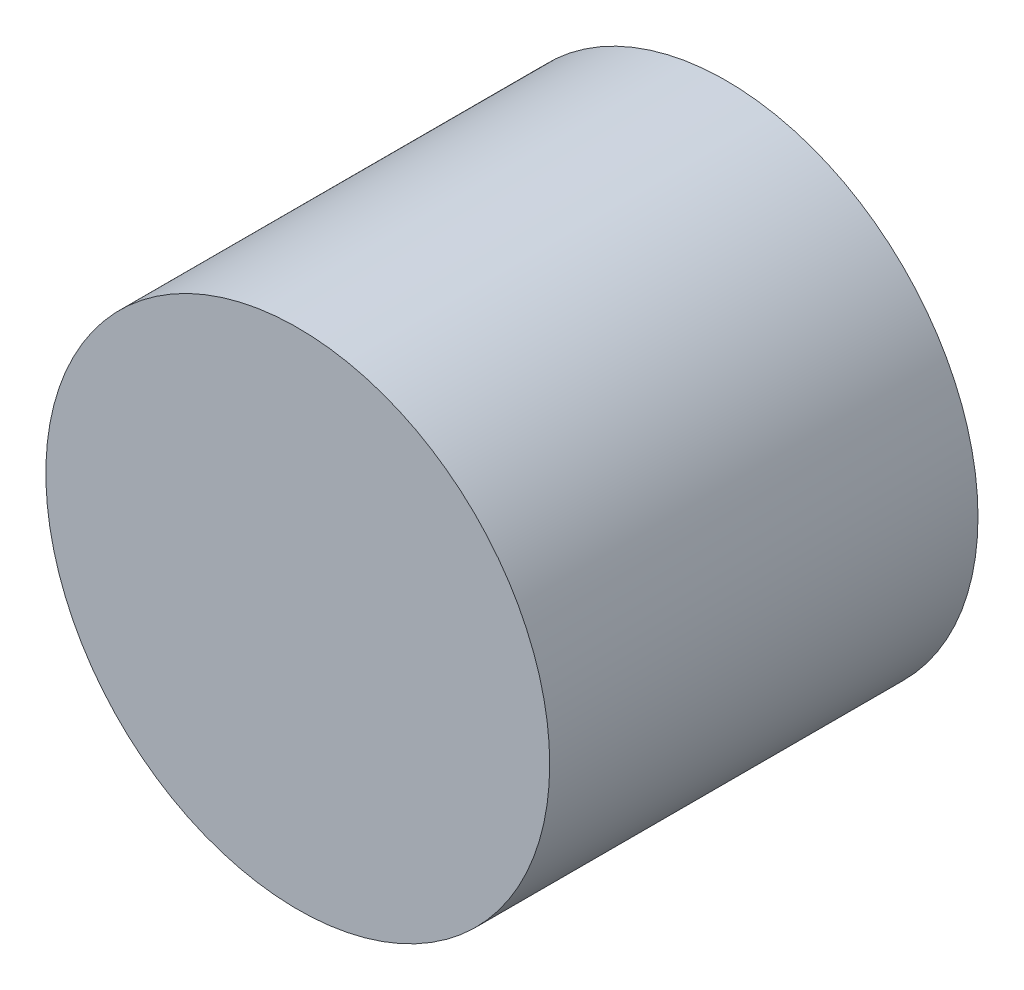
ISO-10303-21;
HEADER;
FILE_DESCRIPTION(('STEP AP214'),'2;1');
FILE_NAME('part.step','',(''),(''),'','','');
FILE_SCHEMA(('AUTOMOTIVE_DESIGN { 1 0 10303 214 1 1 1 1 }'));
ENDSEC;
DATA;
#1=APPLICATION_CONTEXT('core data for automotive mechanical design processes');
#2=APPLICATION_PROTOCOL_DEFINITION('international standard','automotive_design',2000,#1);
#3=PRODUCT_CONTEXT('',#1,'mechanical');
#4=PRODUCT('Part','Part','',(#3));
#5=PRODUCT_RELATED_PRODUCT_CATEGORY('part','',(#4));
#6=PRODUCT_DEFINITION_FORMATION('','',#4);
#7=PRODUCT_DEFINITION_CONTEXT('part definition',#1,'design');
#8=PRODUCT_DEFINITION('design','',#6,#7);
#9=PRODUCT_DEFINITION_SHAPE('','',#8);
#10=(LENGTH_UNIT() NAMED_UNIT(*) SI_UNIT(.MILLI.,.METRE.));
#11=(NAMED_UNIT(*) PLANE_ANGLE_UNIT() SI_UNIT($,.RADIAN.));
#12=(NAMED_UNIT(*) SI_UNIT($,.STERADIAN.) SOLID_ANGLE_UNIT());
#13=UNCERTAINTY_MEASURE_WITH_UNIT(LENGTH_MEASURE(1.E-05),#10,'distance_accuracy_value','');
#14=(GEOMETRIC_REPRESENTATION_CONTEXT(3) GLOBAL_UNCERTAINTY_ASSIGNED_CONTEXT((#13)) GLOBAL_UNIT_ASSIGNED_CONTEXT((#10,
#11,#12)) REPRESENTATION_CONTEXT('',''));
#15=CARTESIAN_POINT('',(0.,0.,0.));
#16=DIRECTION('',(0.,0.,1.));
#17=DIRECTION('',(1.,0.,0.));
#18=AXIS2_PLACEMENT_3D('',#15,#16,#17);
#19=CARTESIAN_POINT('',(0.,0.,17.));
#20=DIRECTION('',(0.,0.,-1.));
#21=DIRECTION('',(-1.,0.,0.));
#22=AXIS2_PLACEMENT_3D('',#19,#20,#21);
#23=CYLINDRICAL_SURFACE('',#22,10.);
#24=CARTESIAN_POINT('',(0.,0.,17.));
#25=DIRECTION('',(0.,0.,1.));
#26=DIRECTION('',(1.,0.,0.));
#27=AXIS2_PLACEMENT_3D('',#24,#25,#26);
#28=CIRCLE('',#27,10.);
#29=CARTESIAN_POINT('',(10.,0.,17.));
#30=VERTEX_POINT('',#29);
#31=EDGE_CURVE('E11',#30,#30,#28,.T.);
#32=ORIENTED_EDGE('',*,*,#31,.F.);
#33=EDGE_LOOP('',(#32));
#34=FACE_BOUND('',#33,.T.);
#35=CARTESIAN_POINT('',(0.,0.,0.));
#36=DIRECTION('',(0.,0.,1.));
#37=DIRECTION('',(1.,0.,0.));
#38=AXIS2_PLACEMENT_3D('',#35,#36,#37);
#39=CIRCLE('',#38,10.);
#40=CARTESIAN_POINT('',(10.,0.,0.));
#41=VERTEX_POINT('',#40);
#42=EDGE_CURVE('E42',#41,#41,#39,.T.);
#43=ORIENTED_EDGE('',*,*,#42,.T.);
#44=EDGE_LOOP('',(#43));
#45=FACE_BOUND('',#44,.T.);
#46=ADVANCED_FACE('F39',(#34,#45),#23,.T.);
#47=CARTESIAN_POINT('',(0.,0.,17.));
#48=DIRECTION('',(0.,0.,1.));
#49=DIRECTION('',(1.,0.,0.));
#50=AXIS2_PLACEMENT_3D('',#47,#48,#49);
#51=PLANE('',#50);
#52=ORIENTED_EDGE('',*,*,#31,.T.);
#53=EDGE_LOOP('',(#52));
#54=FACE_BOUND('',#53,.T.);
#55=ADVANCED_FACE('F140',(#54),#51,.T.);
#56=CARTESIAN_POINT('',(0.,0.,0.));
#57=DIRECTION('',(0.,0.,1.));
#58=DIRECTION('',(1.,0.,0.));
#59=AXIS2_PLACEMENT_3D('',#56,#57,#58);
#60=PLANE('',#59);
#61=CARTESIAN_POINT('',(0.,0.,0.));
#62=DIRECTION('',(0.,0.,-1.));
#63=DIRECTION('',(-1.,0.,0.));
#64=AXIS2_PLACEMENT_3D('',#61,#62,#63);
#65=CIRCLE('',#64,7.5);
#66=CARTESIAN_POINT('',(-7.5,0.,0.));
#67=VERTEX_POINT('',#66);
#68=EDGE_CURVE('E106',#67,#67,#65,.T.);
#69=ORIENTED_EDGE('',*,*,#68,.F.);
#70=EDGE_LOOP('',(#69));
#71=FACE_BOUND('',#70,.T.);
#72=ORIENTED_EDGE('',*,*,#42,.F.);
#73=EDGE_LOOP('',(#72));
#74=FACE_BOUND('',#73,.T.);
#75=ADVANCED_FACE('F137',(#71,#74),#60,.F.);
#76=CARTESIAN_POINT('',(0.,0.,3.5));
#77=DIRECTION('',(0.,0.,-1.));
#78=DIRECTION('',(-1.,0.,0.));
#79=AXIS2_PLACEMENT_3D('',#76,#77,#78);
#80=CYLINDRICAL_SURFACE('',#79,7.5);
#81=CARTESIAN_POINT('',(0.,0.,3.5));
#82=DIRECTION('',(0.,0.,-1.));
#83=DIRECTION('',(-1.,0.,0.));
#84=AXIS2_PLACEMENT_3D('',#81,#82,#83);
#85=CIRCLE('',#84,7.5);
#86=CARTESIAN_POINT('',(-7.5,0.,3.5));
#87=VERTEX_POINT('',#86);
#88=EDGE_CURVE('E127',#87,#87,#85,.T.);
#89=ORIENTED_EDGE('',*,*,#88,.F.);
#90=EDGE_LOOP('',(#89));
#91=FACE_BOUND('',#90,.T.);
#92=ORIENTED_EDGE('',*,*,#68,.T.);
#93=EDGE_LOOP('',(#92));
#94=FACE_BOUND('',#93,.T.);
#95=ADVANCED_FACE('F135',(#91,#94),#80,.F.);
#96=CARTESIAN_POINT('',(0.,0.,3.5));
#97=DIRECTION('',(0.,0.,-1.));
#98=DIRECTION('',(-1.,0.,0.));
#99=AXIS2_PLACEMENT_3D('',#96,#97,#98);
#100=PLANE('',#99);
#101=CARTESIAN_POINT('',(0.,0.,3.5));
#102=DIRECTION('',(0.,0.,-1.));
#103=DIRECTION('',(1.,0.,0.));
#104=AXIS2_PLACEMENT_3D('',#101,#102,#103);
#105=CIRCLE('',#104,3.1);
#106=CARTESIAN_POINT('',(-3.05941170815567,0.5,3.5));
#107=VERTEX_POINT('',#106);
#108=CARTESIAN_POINT('',(3.05941170815567,0.5,3.5));
#109=VERTEX_POINT('',#108);
#110=EDGE_CURVE('E54',#107,#109,#105,.T.);
#111=ORIENTED_EDGE('',*,*,#110,.F.);
#112=DIRECTION('',(-1.,0.,0.));
#113=VECTOR('',#112,1.);
#114=CARTESIAN_POINT('',(3.05941170815567,0.5,3.5));
#115=LINE('',#114,#113);
#116=EDGE_CURVE('E94',#109,#107,#115,.T.);
#117=ORIENTED_EDGE('',*,*,#116,.F.);
#118=EDGE_LOOP('',(#111,#117));
#119=FACE_BOUND('',#118,.T.);
#120=CARTESIAN_POINT('',(0.,0.,3.5));
#121=DIRECTION('',(0.,0.,-1.));
#122=DIRECTION('',(-1.,0.,0.));
#123=AXIS2_PLACEMENT_3D('',#120,#121,#122);
#124=CIRCLE('',#123,3.1);
#125=CARTESIAN_POINT('',(3.05941170815567,-0.5,3.5));
#126=VERTEX_POINT('',#125);
#127=CARTESIAN_POINT('',(-3.05941170815567,-0.5,3.5));
#128=VERTEX_POINT('',#127);
#129=EDGE_CURVE('E62',#126,#128,#124,.T.);
#130=ORIENTED_EDGE('',*,*,#129,.F.);
#131=DIRECTION('',(1.,0.,0.));
#132=VECTOR('',#131,1.);
#133=CARTESIAN_POINT('',(3.05941170815567,-0.5,3.5));
#134=LINE('',#133,#132);
#135=EDGE_CURVE('E113',#128,#126,#134,.T.);
#136=ORIENTED_EDGE('',*,*,#135,.F.);
#137=EDGE_LOOP('',(#130,#136));
#138=FACE_BOUND('',#137,.T.);
#139=ORIENTED_EDGE('',*,*,#88,.T.);
#140=EDGE_LOOP('',(#139));
#141=FACE_BOUND('',#140,.T.);
#142=ADVANCED_FACE('F158',(#119,#138,#141),#100,.T.);
#143=CARTESIAN_POINT('',(0.,0.,10.5));
#144=DIRECTION('',(0.,0.,-1.));
#145=DIRECTION('',(-1.,0.,0.));
#146=AXIS2_PLACEMENT_3D('',#143,#144,#145);
#147=CYLINDRICAL_SURFACE('',#146,3.1);
#148=ORIENTED_EDGE('',*,*,#129,.T.);
#149=DIRECTION('',(0.,0.,-1.));
#150=VECTOR('',#149,1.);
#151=CARTESIAN_POINT('',(-3.05941170815567,-0.5,10.5));
#152=LINE('',#151,#150);
#153=CARTESIAN_POINT('',(-3.05941170815567,-0.5,10.5));
#154=VERTEX_POINT('',#153);
#155=EDGE_CURVE('E117',#154,#128,#152,.T.);
#156=ORIENTED_EDGE('',*,*,#155,.F.);
#157=CARTESIAN_POINT('',(0.,0.,10.5));
#158=DIRECTION('',(0.,0.,-1.));
#159=DIRECTION('',(-1.,0.,0.));
#160=AXIS2_PLACEMENT_3D('',#157,#158,#159);
#161=CIRCLE('',#160,3.1);
#162=CARTESIAN_POINT('',(3.05941170815567,-0.5,10.5));
#163=VERTEX_POINT('',#162);
#164=EDGE_CURVE('E108',#163,#154,#161,.T.);
#165=ORIENTED_EDGE('',*,*,#164,.F.);
#166=DIRECTION('',(0.,0.,-1.));
#167=VECTOR('',#166,1.);
#168=CARTESIAN_POINT('',(3.05941170815567,-0.5,10.5));
#169=LINE('',#168,#167);
#170=EDGE_CURVE('E102',#163,#126,#169,.T.);
#171=ORIENTED_EDGE('',*,*,#170,.T.);
#172=EDGE_LOOP('',(#148,#156,#165,#171));
#173=FACE_BOUND('',#172,.T.);
#174=ADVANCED_FACE('F162',(#173),#147,.F.);
#175=CARTESIAN_POINT('',(3.05941170815567,-0.5,10.5));
#176=DIRECTION('',(0.,1.,0.));
#177=DIRECTION('',(0.,0.,1.));
#178=AXIS2_PLACEMENT_3D('',#175,#176,#177);
#179=PLANE('',#178);
#180=ORIENTED_EDGE('',*,*,#135,.T.);
#181=ORIENTED_EDGE('',*,*,#170,.F.);
#182=DIRECTION('',(1.,0.,0.));
#183=VECTOR('',#182,1.);
#184=CARTESIAN_POINT('',(3.05941170815567,-0.5,10.5));
#185=LINE('',#184,#183);
#186=EDGE_CURVE('E112',#154,#163,#185,.T.);
#187=ORIENTED_EDGE('',*,*,#186,.F.);
#188=ORIENTED_EDGE('',*,*,#155,.T.);
#189=EDGE_LOOP('',(#180,#181,#187,#188));
#190=FACE_BOUND('',#189,.T.);
#191=ADVANCED_FACE('F166',(#190),#179,.F.);
#192=CARTESIAN_POINT('',(0.,0.,10.5));
#193=DIRECTION('',(0.,0.,-1.));
#194=DIRECTION('',(-1.,0.,0.));
#195=AXIS2_PLACEMENT_3D('',#192,#193,#194);
#196=PLANE('',#195);
#197=ORIENTED_EDGE('',*,*,#164,.T.);
#198=ORIENTED_EDGE('',*,*,#186,.T.);
#199=EDGE_LOOP('',(#197,#198));
#200=FACE_BOUND('',#199,.T.);
#201=ADVANCED_FACE('F169',(#200),#196,.T.);
#202=CARTESIAN_POINT('',(0.,0.,10.5));
#203=DIRECTION('',(0.,0.,-1.));
#204=DIRECTION('',(-1.,0.,0.));
#205=AXIS2_PLACEMENT_3D('',#202,#203,#204);
#206=CYLINDRICAL_SURFACE('',#205,3.1);
#207=ORIENTED_EDGE('',*,*,#110,.T.);
#208=DIRECTION('',(0.,0.,-1.));
#209=VECTOR('',#208,1.);
#210=CARTESIAN_POINT('',(3.05941170815567,0.5,10.5));
#211=LINE('',#210,#209);
#212=CARTESIAN_POINT('',(3.05941170815567,0.5,10.5));
#213=VERTEX_POINT('',#212);
#214=EDGE_CURVE('E78',#213,#109,#211,.T.);
#215=ORIENTED_EDGE('',*,*,#214,.F.);
#216=CARTESIAN_POINT('',(0.,0.,10.5));
#217=DIRECTION('',(0.,0.,-1.));
#218=DIRECTION('',(1.,0.,0.));
#219=AXIS2_PLACEMENT_3D('',#216,#217,#218);
#220=CIRCLE('',#219,3.1);
#221=CARTESIAN_POINT('',(-3.05941170815567,0.5,10.5));
#222=VERTEX_POINT('',#221);
#223=EDGE_CURVE('E81',#222,#213,#220,.T.);
#224=ORIENTED_EDGE('',*,*,#223,.F.);
#225=DIRECTION('',(0.,0.,-1.));
#226=VECTOR('',#225,1.);
#227=CARTESIAN_POINT('',(-3.05941170815567,0.5,10.5));
#228=LINE('',#227,#226);
#229=EDGE_CURVE('E88',#222,#107,#228,.T.);
#230=ORIENTED_EDGE('',*,*,#229,.T.);
#231=EDGE_LOOP('',(#207,#215,#224,#230));
#232=FACE_BOUND('',#231,.T.);
#233=ADVANCED_FACE('F80',(#232),#206,.F.);
#234=CARTESIAN_POINT('',(3.05941170815567,0.5,10.5));
#235=DIRECTION('',(0.,-1.,0.));
#236=DIRECTION('',(0.,0.,-1.));
#237=AXIS2_PLACEMENT_3D('',#234,#235,#236);
#238=PLANE('',#237);
#239=ORIENTED_EDGE('',*,*,#116,.T.);
#240=ORIENTED_EDGE('',*,*,#229,.F.);
#241=DIRECTION('',(-1.,0.,0.));
#242=VECTOR('',#241,1.);
#243=CARTESIAN_POINT('',(3.05941170815567,0.5,10.5));
#244=LINE('',#243,#242);
#245=EDGE_CURVE('E89',#213,#222,#244,.T.);
#246=ORIENTED_EDGE('',*,*,#245,.F.);
#247=ORIENTED_EDGE('',*,*,#214,.T.);
#248=EDGE_LOOP('',(#239,#240,#246,#247));
#249=FACE_BOUND('',#248,.T.);
#250=ADVANCED_FACE('F96',(#249),#238,.F.);
#251=CARTESIAN_POINT('',(0.,0.,10.5));
#252=DIRECTION('',(0.,0.,1.));
#253=DIRECTION('',(1.,0.,0.));
#254=AXIS2_PLACEMENT_3D('',#251,#252,#253);
#255=PLANE('',#254);
#256=ORIENTED_EDGE('',*,*,#223,.T.);
#257=ORIENTED_EDGE('',*,*,#245,.T.);
#258=EDGE_LOOP('',(#256,#257));
#259=FACE_BOUND('',#258,.T.);
#260=ADVANCED_FACE('F92',(#259),#255,.F.);
#261=CLOSED_SHELL('',(#46,#55,#75,#95,#142,#174,#191,#201,#233,#250,#260));
#262=MANIFOLD_SOLID_BREP('B2',#261);
#263=ADVANCED_BREP_SHAPE_REPRESENTATION('',(#18,#262),#14);
#264=SHAPE_DEFINITION_REPRESENTATION(#9,#263);
ENDSEC;
END-ISO-10303-21;
